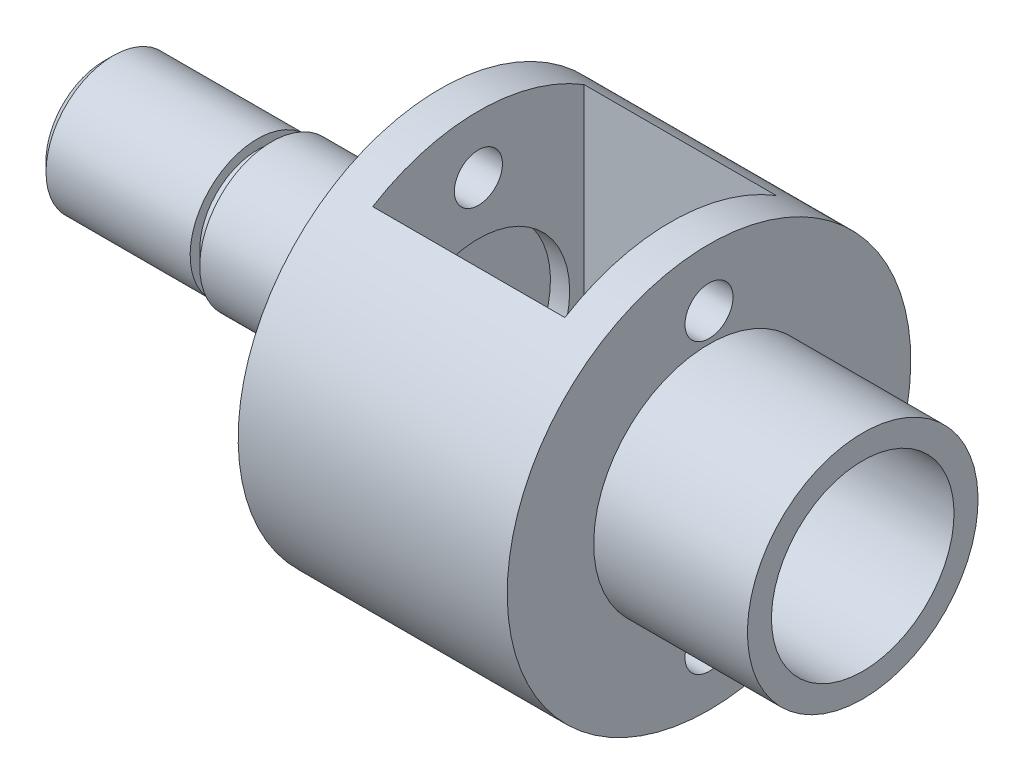
ISO-10303-21;
HEADER;
FILE_DESCRIPTION(('STEP AP214'),'2;1');
FILE_NAME('part.step','',(''),(''),'','','');
FILE_SCHEMA(('AUTOMOTIVE_DESIGN { 1 0 10303 214 1 1 1 1 }'));
ENDSEC;
DATA;
#1=APPLICATION_CONTEXT('core data for automotive mechanical design processes');
#2=APPLICATION_PROTOCOL_DEFINITION('international standard','automotive_design',2000,#1);
#3=PRODUCT_CONTEXT('',#1,'mechanical');
#4=PRODUCT('Part','Part','',(#3));
#5=PRODUCT_RELATED_PRODUCT_CATEGORY('part','',(#4));
#6=PRODUCT_DEFINITION_FORMATION('','',#4);
#7=PRODUCT_DEFINITION_CONTEXT('part definition',#1,'design');
#8=PRODUCT_DEFINITION('design','',#6,#7);
#9=PRODUCT_DEFINITION_SHAPE('','',#8);
#10=(LENGTH_UNIT() NAMED_UNIT(*) SI_UNIT(.MILLI.,.METRE.));
#11=(NAMED_UNIT(*) PLANE_ANGLE_UNIT() SI_UNIT($,.RADIAN.));
#12=(NAMED_UNIT(*) SI_UNIT($,.STERADIAN.) SOLID_ANGLE_UNIT());
#13=UNCERTAINTY_MEASURE_WITH_UNIT(LENGTH_MEASURE(1.E-05),#10,'distance_accuracy_value','');
#14=(GEOMETRIC_REPRESENTATION_CONTEXT(3) GLOBAL_UNCERTAINTY_ASSIGNED_CONTEXT((#13)) GLOBAL_UNIT_ASSIGNED_CONTEXT((#10,
#11,#12)) REPRESENTATION_CONTEXT('',''));
#15=CARTESIAN_POINT('',(0.,0.,0.));
#16=DIRECTION('',(0.,0.,1.));
#17=DIRECTION('',(1.,0.,0.));
#18=AXIS2_PLACEMENT_3D('',#15,#16,#17);
#19=CARTESIAN_POINT('',(-21.,0.,0.));
#20=DIRECTION('',(-1.,0.,0.));
#21=DIRECTION('',(0.,-1.,0.));
#22=AXIS2_PLACEMENT_3D('',#19,#20,#21);
#23=CYLINDRICAL_SURFACE('',#22,4.75);
#24=CARTESIAN_POINT('',(0.,0.,0.));
#25=DIRECTION('',(-1.,0.,0.));
#26=DIRECTION('',(0.,-1.,0.));
#27=AXIS2_PLACEMENT_3D('',#24,#25,#26);
#28=CIRCLE('',#27,4.75);
#29=CARTESIAN_POINT('',(0.,-4.75,0.));
#30=VERTEX_POINT('',#29);
#31=EDGE_CURVE('E194',#30,#30,#28,.T.);
#32=ORIENTED_EDGE('',*,*,#31,.F.);
#33=EDGE_LOOP('',(#32));
#34=FACE_BOUND('',#33,.T.);
#35=CARTESIAN_POINT('',(-10.,0.,0.));
#36=DIRECTION('',(-1.,0.,0.));
#37=DIRECTION('',(0.,0.,1.));
#38=AXIS2_PLACEMENT_3D('',#35,#36,#37);
#39=CIRCLE('',#38,4.75);
#40=CARTESIAN_POINT('',(-10.,0.,4.75));
#41=VERTEX_POINT('',#40);
#42=EDGE_CURVE('E122',#41,#41,#39,.T.);
#43=ORIENTED_EDGE('',*,*,#42,.T.);
#44=EDGE_LOOP('',(#43));
#45=FACE_BOUND('',#44,.T.);
#46=ADVANCED_FACE('F49',(#34,#45),#23,.F.);
#47=CARTESIAN_POINT('',(-21.,0.,0.));
#48=DIRECTION('',(-1.,0.,0.));
#49=DIRECTION('',(0.,-1.,0.));
#50=AXIS2_PLACEMENT_3D('',#47,#48,#49);
#51=CYLINDRICAL_SURFACE('',#50,10.5);
#52=CARTESIAN_POINT('',(-20.,0.,0.));
#53=DIRECTION('',(-1.,0.,0.));
#54=DIRECTION('',(0.,0.,1.));
#55=AXIS2_PLACEMENT_3D('',#52,#53,#54);
#56=CIRCLE('',#55,10.5);
#57=CARTESIAN_POINT('',(-20.,-8.94427190999916,5.5));
#58=VERTEX_POINT('',#57);
#59=CARTESIAN_POINT('',(-20.,-8.94427190999916,-5.5));
#60=VERTEX_POINT('',#59);
#61=EDGE_CURVE('E101',#58,#60,#56,.F.);
#62=ORIENTED_EDGE('',*,*,#61,.F.);
#63=DIRECTION('',(-1.,0.,0.));
#64=VECTOR('',#63,1.);
#65=CARTESIAN_POINT('',(-21.,-8.94427190999916,5.5));
#66=LINE('',#65,#64);
#67=CARTESIAN_POINT('',(-10.,-8.94427190999916,5.5));
#68=VERTEX_POINT('',#67);
#69=EDGE_CURVE('E118',#68,#58,#66,.T.);
#70=ORIENTED_EDGE('',*,*,#69,.F.);
#71=CARTESIAN_POINT('',(-10.,0.,0.));
#72=DIRECTION('',(1.,0.,0.));
#73=DIRECTION('',(0.,0.,-1.));
#74=AXIS2_PLACEMENT_3D('',#71,#72,#73);
#75=CIRCLE('',#74,10.5);
#76=CARTESIAN_POINT('',(-10.,-8.94427190999916,-5.5));
#77=VERTEX_POINT('',#76);
#78=EDGE_CURVE('E114',#77,#68,#75,.F.);
#79=ORIENTED_EDGE('',*,*,#78,.F.);
#80=DIRECTION('',(-1.,0.,0.));
#81=VECTOR('',#80,1.);
#82=CARTESIAN_POINT('',(-21.,-8.94427190999916,-5.5));
#83=LINE('',#82,#81);
#84=EDGE_CURVE('E73',#60,#77,#83,.F.);
#85=ORIENTED_EDGE('',*,*,#84,.F.);
#86=EDGE_LOOP('',(#62,#70,#79,#85));
#87=FACE_BOUND('',#86,.T.);
#88=CARTESIAN_POINT('',(-22.,0.,0.));
#89=DIRECTION('',(-1.,0.,0.));
#90=DIRECTION('',(0.,-1.,0.));
#91=AXIS2_PLACEMENT_3D('',#88,#89,#90);
#92=CIRCLE('',#91,10.5);
#93=CARTESIAN_POINT('',(-22.,-10.5,0.));
#94=VERTEX_POINT('',#93);
#95=EDGE_CURVE('E182',#94,#94,#92,.T.);
#96=ORIENTED_EDGE('',*,*,#95,.F.);
#97=EDGE_LOOP('',(#96));
#98=FACE_BOUND('',#97,.T.);
#99=CARTESIAN_POINT('',(-8.,0.,0.));
#100=DIRECTION('',(-1.,0.,0.));
#101=DIRECTION('',(0.,-1.,0.));
#102=AXIS2_PLACEMENT_3D('',#99,#100,#101);
#103=CIRCLE('',#102,10.5);
#104=CARTESIAN_POINT('',(-8.,-10.5,0.));
#105=VERTEX_POINT('',#104);
#106=EDGE_CURVE('E185',#105,#105,#103,.T.);
#107=ORIENTED_EDGE('',*,*,#106,.T.);
#108=EDGE_LOOP('',(#107));
#109=FACE_BOUND('',#108,.T.);
#110=CARTESIAN_POINT('',(-20.,0.,0.));
#111=DIRECTION('',(1.,0.,0.));
#112=DIRECTION('',(0.,0.,-1.));
#113=AXIS2_PLACEMENT_3D('',#110,#111,#112);
#114=CIRCLE('',#113,10.5);
#115=CARTESIAN_POINT('',(-20.,8.94427190999916,5.5));
#116=VERTEX_POINT('',#115);
#117=CARTESIAN_POINT('',(-20.,8.94427190999916,-5.5));
#118=VERTEX_POINT('',#117);
#119=EDGE_CURVE('E135',#116,#118,#114,.F.);
#120=ORIENTED_EDGE('',*,*,#119,.T.);
#121=DIRECTION('',(-1.,0.,0.));
#122=VECTOR('',#121,1.);
#123=CARTESIAN_POINT('',(-21.,8.94427190999916,-5.5));
#124=LINE('',#123,#122);
#125=CARTESIAN_POINT('',(-10.,8.94427190999916,-5.5));
#126=VERTEX_POINT('',#125);
#127=EDGE_CURVE('E94',#118,#126,#124,.F.);
#128=ORIENTED_EDGE('',*,*,#127,.T.);
#129=CARTESIAN_POINT('',(-10.,0.,0.));
#130=DIRECTION('',(-1.,0.,0.));
#131=DIRECTION('',(0.,0.,1.));
#132=AXIS2_PLACEMENT_3D('',#129,#130,#131);
#133=CIRCLE('',#132,10.5);
#134=CARTESIAN_POINT('',(-10.,8.94427190999916,5.5));
#135=VERTEX_POINT('',#134);
#136=EDGE_CURVE('E97',#126,#135,#133,.F.);
#137=ORIENTED_EDGE('',*,*,#136,.T.);
#138=DIRECTION('',(-1.,0.,0.));
#139=VECTOR('',#138,1.);
#140=CARTESIAN_POINT('',(-21.,8.94427190999916,5.5));
#141=LINE('',#140,#139);
#142=EDGE_CURVE('E132',#135,#116,#141,.T.);
#143=ORIENTED_EDGE('',*,*,#142,.T.);
#144=EDGE_LOOP('',(#120,#128,#137,#143));
#145=FACE_BOUND('',#144,.T.);
#146=ADVANCED_FACE('F112',(#87,#98,#109,#145),#51,.T.);
#147=CARTESIAN_POINT('',(-8.,-7.5,0.));
#148=DIRECTION('',(1.,0.,0.));
#149=DIRECTION('',(0.,0.,-1.));
#150=AXIS2_PLACEMENT_3D('',#147,#148,#149);
#151=CYLINDRICAL_SURFACE('',#150,1.24999999999999);
#152=CARTESIAN_POINT('',(-22.,-7.5,0.));
#153=DIRECTION('',(1.,0.,0.));
#154=DIRECTION('',(0.,1.,0.));
#155=AXIS2_PLACEMENT_3D('',#152,#153,#154);
#156=CIRCLE('',#155,1.24999999999999);
#157=CARTESIAN_POINT('',(-22.,-6.25000000000001,0.));
#158=VERTEX_POINT('',#157);
#159=EDGE_CURVE('E155',#158,#158,#156,.T.);
#160=ORIENTED_EDGE('',*,*,#159,.F.);
#161=EDGE_LOOP('',(#160));
#162=FACE_BOUND('',#161,.T.);
#163=CARTESIAN_POINT('',(-20.,-7.5,0.));
#164=DIRECTION('',(-1.,0.,0.));
#165=DIRECTION('',(0.,0.,1.));
#166=AXIS2_PLACEMENT_3D('',#163,#164,#165);
#167=CIRCLE('',#166,1.24999999999999);
#168=CARTESIAN_POINT('',(-20.,-7.5,1.25000000000004));
#169=VERTEX_POINT('',#168);
#170=EDGE_CURVE('E109',#169,#169,#167,.T.);
#171=ORIENTED_EDGE('',*,*,#170,.F.);
#172=EDGE_LOOP('',(#171));
#173=FACE_BOUND('',#172,.T.);
#174=ADVANCED_FACE('F217',(#162,#173),#151,.F.);
#175=CARTESIAN_POINT('',(-8.,-7.5,0.));
#176=DIRECTION('',(1.,0.,0.));
#177=DIRECTION('',(0.,0.,-1.));
#178=AXIS2_PLACEMENT_3D('',#175,#176,#177);
#179=CIRCLE('',#178,1.24999999999999);
#180=CARTESIAN_POINT('',(-8.,-7.5,-1.24999999999993));
#181=VERTEX_POINT('',#180);
#182=EDGE_CURVE('E152',#181,#181,#179,.T.);
#183=ORIENTED_EDGE('',*,*,#182,.T.);
#184=EDGE_LOOP('',(#183));
#185=FACE_BOUND('',#184,.T.);
#186=CARTESIAN_POINT('',(-10.,-7.5,0.));
#187=DIRECTION('',(1.,0.,0.));
#188=DIRECTION('',(0.,0.,-1.));
#189=AXIS2_PLACEMENT_3D('',#186,#187,#188);
#190=CIRCLE('',#189,1.24999999999999);
#191=CARTESIAN_POINT('',(-10.,-7.5,-1.24999999999994));
#192=VERTEX_POINT('',#191);
#193=EDGE_CURVE('E108',#192,#192,#190,.T.);
#194=ORIENTED_EDGE('',*,*,#193,.F.);
#195=EDGE_LOOP('',(#194));
#196=FACE_BOUND('',#195,.T.);
#197=ADVANCED_FACE('F273',(#185,#196),#151,.F.);
#198=CARTESIAN_POINT('',(-8.,7.5,0.));
#199=DIRECTION('',(1.,0.,0.));
#200=DIRECTION('',(0.,0.,-1.));
#201=AXIS2_PLACEMENT_3D('',#198,#199,#200);
#202=CYLINDRICAL_SURFACE('',#201,1.24999999999999);
#203=CARTESIAN_POINT('',(-22.,7.5,0.));
#204=DIRECTION('',(1.,0.,0.));
#205=DIRECTION('',(0.,1.,0.));
#206=AXIS2_PLACEMENT_3D('',#203,#204,#205);
#207=CIRCLE('',#206,1.24999999999999);
#208=CARTESIAN_POINT('',(-22.,8.74999999999999,0.));
#209=VERTEX_POINT('',#208);
#210=EDGE_CURVE('E149',#209,#209,#207,.T.);
#211=ORIENTED_EDGE('',*,*,#210,.F.);
#212=EDGE_LOOP('',(#211));
#213=FACE_BOUND('',#212,.T.);
#214=CARTESIAN_POINT('',(-20.,7.5,0.));
#215=DIRECTION('',(1.,0.,0.));
#216=DIRECTION('',(0.,0.,-1.));
#217=AXIS2_PLACEMENT_3D('',#214,#215,#216);
#218=CIRCLE('',#217,1.24999999999999);
#219=CARTESIAN_POINT('',(-20.,7.5,-1.24999999999999));
#220=VERTEX_POINT('',#219);
#221=EDGE_CURVE('E129',#220,#220,#218,.T.);
#222=ORIENTED_EDGE('',*,*,#221,.T.);
#223=EDGE_LOOP('',(#222));
#224=FACE_BOUND('',#223,.T.);
#225=ADVANCED_FACE('F275',(#213,#224),#202,.F.);
#226=CARTESIAN_POINT('',(-8.,7.5,0.));
#227=DIRECTION('',(1.,0.,0.));
#228=DIRECTION('',(0.,0.,-1.));
#229=AXIS2_PLACEMENT_3D('',#226,#227,#228);
#230=CIRCLE('',#229,1.24999999999999);
#231=CARTESIAN_POINT('',(-8.,7.5,-1.24999999999999));
#232=VERTEX_POINT('',#231);
#233=EDGE_CURVE('E146',#232,#232,#230,.T.);
#234=ORIENTED_EDGE('',*,*,#233,.T.);
#235=EDGE_LOOP('',(#234));
#236=FACE_BOUND('',#235,.T.);
#237=CARTESIAN_POINT('',(-10.,7.5,0.));
#238=DIRECTION('',(-1.,0.,0.));
#239=DIRECTION('',(0.,0.,1.));
#240=AXIS2_PLACEMENT_3D('',#237,#238,#239);
#241=CIRCLE('',#240,1.24999999999999);
#242=CARTESIAN_POINT('',(-10.,7.5,1.24999999999999));
#243=VERTEX_POINT('',#242);
#244=EDGE_CURVE('E128',#243,#243,#241,.T.);
#245=ORIENTED_EDGE('',*,*,#244,.T.);
#246=EDGE_LOOP('',(#245));
#247=FACE_BOUND('',#246,.T.);
#248=ADVANCED_FACE('F233',(#236,#247),#202,.F.);
#249=CARTESIAN_POINT('',(-8.,6.,0.));
#250=DIRECTION('',(-1.,0.,0.));
#251=DIRECTION('',(0.,-1.,0.));
#252=AXIS2_PLACEMENT_3D('',#249,#250,#251);
#253=PLANE('',#252);
#254=ORIENTED_EDGE('',*,*,#182,.F.);
#255=EDGE_LOOP('',(#254));
#256=FACE_BOUND('',#255,.T.);
#257=ORIENTED_EDGE('',*,*,#106,.F.);
#258=EDGE_LOOP('',(#257));
#259=FACE_BOUND('',#258,.T.);
#260=CARTESIAN_POINT('',(-8.,0.,0.));
#261=DIRECTION('',(-1.,0.,0.));
#262=DIRECTION('',(0.,-1.,0.));
#263=AXIS2_PLACEMENT_3D('',#260,#261,#262);
#264=CIRCLE('',#263,6.);
#265=CARTESIAN_POINT('',(-8.,-6.,0.));
#266=VERTEX_POINT('',#265);
#267=EDGE_CURVE('E188',#266,#266,#264,.T.);
#268=ORIENTED_EDGE('',*,*,#267,.T.);
#269=EDGE_LOOP('',(#268));
#270=FACE_BOUND('',#269,.T.);
#271=ORIENTED_EDGE('',*,*,#233,.F.);
#272=EDGE_LOOP('',(#271));
#273=FACE_BOUND('',#272,.T.);
#274=ADVANCED_FACE('F226',(#256,#259,#270,#273),#253,.F.);
#275=CARTESIAN_POINT('',(0.,4.75,0.));
#276=DIRECTION('',(-1.,0.,0.));
#277=DIRECTION('',(0.,-1.,0.));
#278=AXIS2_PLACEMENT_3D('',#275,#276,#277);
#279=PLANE('',#278);
#280=CARTESIAN_POINT('',(0.,0.,0.));
#281=DIRECTION('',(-1.,0.,0.));
#282=DIRECTION('',(0.,-1.,0.));
#283=AXIS2_PLACEMENT_3D('',#280,#281,#282);
#284=CIRCLE('',#283,6.);
#285=CARTESIAN_POINT('',(0.,-6.,0.));
#286=VERTEX_POINT('',#285);
#287=EDGE_CURVE('E191',#286,#286,#284,.T.);
#288=ORIENTED_EDGE('',*,*,#287,.F.);
#289=EDGE_LOOP('',(#288));
#290=FACE_BOUND('',#289,.T.);
#291=ORIENTED_EDGE('',*,*,#31,.T.);
#292=EDGE_LOOP('',(#291));
#293=FACE_BOUND('',#292,.T.);
#294=ADVANCED_FACE('F222',(#290,#293),#279,.F.);
#295=CARTESIAN_POINT('',(-21.,0.,0.));
#296=DIRECTION('',(-1.,0.,0.));
#297=DIRECTION('',(0.,-1.,0.));
#298=AXIS2_PLACEMENT_3D('',#295,#296,#297);
#299=CYLINDRICAL_SURFACE('',#298,6.);
#300=ORIENTED_EDGE('',*,*,#267,.F.);
#301=EDGE_LOOP('',(#300));
#302=FACE_BOUND('',#301,.T.);
#303=ORIENTED_EDGE('',*,*,#287,.T.);
#304=EDGE_LOOP('',(#303));
#305=FACE_BOUND('',#304,.T.);
#306=ADVANCED_FACE('F225',(#302,#305),#299,.T.);
#307=CARTESIAN_POINT('',(-22.,10.5,0.));
#308=DIRECTION('',(1.,0.,0.));
#309=DIRECTION('',(0.,1.,0.));
#310=AXIS2_PLACEMENT_3D('',#307,#308,#309);
#311=PLANE('',#310);
#312=ORIENTED_EDGE('',*,*,#210,.T.);
#313=EDGE_LOOP('',(#312));
#314=FACE_BOUND('',#313,.T.);
#315=ORIENTED_EDGE('',*,*,#159,.T.);
#316=EDGE_LOOP('',(#315));
#317=FACE_BOUND('',#316,.T.);
#318=CARTESIAN_POINT('',(-22.,0.,0.));
#319=DIRECTION('',(-1.,0.,0.));
#320=DIRECTION('',(0.,-1.,0.));
#321=AXIS2_PLACEMENT_3D('',#318,#319,#320);
#322=CIRCLE('',#321,6.);
#323=CARTESIAN_POINT('',(-22.,-6.00000000000001,0.));
#324=VERTEX_POINT('',#323);
#325=EDGE_CURVE('E179',#324,#324,#322,.T.);
#326=ORIENTED_EDGE('',*,*,#325,.F.);
#327=EDGE_LOOP('',(#326));
#328=FACE_BOUND('',#327,.T.);
#329=ORIENTED_EDGE('',*,*,#95,.T.);
#330=EDGE_LOOP('',(#329));
#331=FACE_BOUND('',#330,.T.);
#332=ADVANCED_FACE('F230',(#314,#317,#328,#331),#311,.F.);
#333=CARTESIAN_POINT('',(-21.,0.,0.));
#334=DIRECTION('',(-1.,0.,0.));
#335=DIRECTION('',(0.,-1.,0.));
#336=AXIS2_PLACEMENT_3D('',#333,#334,#335);
#337=CYLINDRICAL_SURFACE('',#336,6.);
#338=CARTESIAN_POINT('',(-24.5,0.,0.));
#339=DIRECTION('',(-1.,0.,0.));
#340=DIRECTION('',(0.,-1.,0.));
#341=AXIS2_PLACEMENT_3D('',#338,#339,#340);
#342=CIRCLE('',#341,6.);
#343=CARTESIAN_POINT('',(-24.5,-6.00000000000001,0.));
#344=VERTEX_POINT('',#343);
#345=EDGE_CURVE('E176',#344,#344,#342,.T.);
#346=ORIENTED_EDGE('',*,*,#345,.F.);
#347=EDGE_LOOP('',(#346));
#348=FACE_BOUND('',#347,.T.);
#349=ORIENTED_EDGE('',*,*,#325,.T.);
#350=EDGE_LOOP('',(#349));
#351=FACE_BOUND('',#350,.T.);
#352=ADVANCED_FACE('F237',(#348,#351),#337,.T.);
#353=CARTESIAN_POINT('',(-24.5,6.,0.));
#354=DIRECTION('',(1.,0.,0.));
#355=DIRECTION('',(0.,1.,0.));
#356=AXIS2_PLACEMENT_3D('',#353,#354,#355);
#357=PLANE('',#356);
#358=CARTESIAN_POINT('',(-24.5,0.,0.));
#359=DIRECTION('',(-1.,0.,0.));
#360=DIRECTION('',(0.,-1.,0.));
#361=AXIS2_PLACEMENT_3D('',#358,#359,#360);
#362=CIRCLE('',#361,3.75);
#363=CARTESIAN_POINT('',(-24.5,-3.75000000000001,0.));
#364=VERTEX_POINT('',#363);
#365=EDGE_CURVE('E173',#364,#364,#362,.T.);
#366=ORIENTED_EDGE('',*,*,#365,.F.);
#367=EDGE_LOOP('',(#366));
#368=FACE_BOUND('',#367,.T.);
#369=ORIENTED_EDGE('',*,*,#345,.T.);
#370=EDGE_LOOP('',(#369));
#371=FACE_BOUND('',#370,.T.);
#372=ADVANCED_FACE('F241',(#368,#371),#357,.F.);
#373=CARTESIAN_POINT('',(-21.,0.,0.));
#374=DIRECTION('',(-1.,0.,0.));
#375=DIRECTION('',(0.,-1.,0.));
#376=AXIS2_PLACEMENT_3D('',#373,#374,#375);
#377=CYLINDRICAL_SURFACE('',#376,3.75);
#378=CARTESIAN_POINT('',(-30.75,0.,0.));
#379=DIRECTION('',(-1.,0.,0.));
#380=DIRECTION('',(0.,-1.,0.));
#381=AXIS2_PLACEMENT_3D('',#378,#379,#380);
#382=CIRCLE('',#381,3.75);
#383=CARTESIAN_POINT('',(-30.75,-3.75000000000001,0.));
#384=VERTEX_POINT('',#383);
#385=EDGE_CURVE('E170',#384,#384,#382,.T.);
#386=ORIENTED_EDGE('',*,*,#385,.F.);
#387=EDGE_LOOP('',(#386));
#388=FACE_BOUND('',#387,.T.);
#389=ORIENTED_EDGE('',*,*,#365,.T.);
#390=EDGE_LOOP('',(#389));
#391=FACE_BOUND('',#390,.T.);
#392=ADVANCED_FACE('F245',(#388,#391),#377,.T.);
#393=CARTESIAN_POINT('',(-30.75,3.75,0.));
#394=DIRECTION('',(1.,0.,0.));
#395=DIRECTION('',(0.,1.,0.));
#396=AXIS2_PLACEMENT_3D('',#393,#394,#395);
#397=PLANE('',#396);
#398=CARTESIAN_POINT('',(-30.75,0.,0.));
#399=DIRECTION('',(-1.,0.,0.));
#400=DIRECTION('',(0.,-1.,0.));
#401=AXIS2_PLACEMENT_3D('',#398,#399,#400);
#402=CIRCLE('',#401,3.);
#403=CARTESIAN_POINT('',(-30.75,-3.00000000000001,0.));
#404=VERTEX_POINT('',#403);
#405=EDGE_CURVE('E167',#404,#404,#402,.T.);
#406=ORIENTED_EDGE('',*,*,#405,.F.);
#407=EDGE_LOOP('',(#406));
#408=FACE_BOUND('',#407,.T.);
#409=ORIENTED_EDGE('',*,*,#385,.T.);
#410=EDGE_LOOP('',(#409));
#411=FACE_BOUND('',#410,.T.);
#412=ADVANCED_FACE('F249',(#408,#411),#397,.F.);
#413=CARTESIAN_POINT('',(-21.,0.,0.));
#414=DIRECTION('',(-1.,0.,0.));
#415=DIRECTION('',(0.,-1.,0.));
#416=AXIS2_PLACEMENT_3D('',#413,#414,#415);
#417=CYLINDRICAL_SURFACE('',#416,3.);
#418=CARTESIAN_POINT('',(-31.5,0.,0.));
#419=DIRECTION('',(-1.,0.,0.));
#420=DIRECTION('',(0.,-1.,0.));
#421=AXIS2_PLACEMENT_3D('',#418,#419,#420);
#422=CIRCLE('',#421,3.);
#423=CARTESIAN_POINT('',(-31.5,-3.00000000000001,0.));
#424=VERTEX_POINT('',#423);
#425=EDGE_CURVE('E164',#424,#424,#422,.T.);
#426=ORIENTED_EDGE('',*,*,#425,.F.);
#427=EDGE_LOOP('',(#426));
#428=FACE_BOUND('',#427,.T.);
#429=ORIENTED_EDGE('',*,*,#405,.T.);
#430=EDGE_LOOP('',(#429));
#431=FACE_BOUND('',#430,.T.);
#432=ADVANCED_FACE('F253',(#428,#431),#417,.T.);
#433=CARTESIAN_POINT('',(-31.5,3.,0.));
#434=DIRECTION('',(-1.,0.,0.));
#435=DIRECTION('',(0.,-1.,0.));
#436=AXIS2_PLACEMENT_3D('',#433,#434,#435);
#437=PLANE('',#436);
#438=CARTESIAN_POINT('',(-31.5,0.,0.));
#439=DIRECTION('',(-1.,0.,0.));
#440=DIRECTION('',(0.,-1.,0.));
#441=AXIS2_PLACEMENT_3D('',#438,#439,#440);
#442=CIRCLE('',#441,3.5);
#443=CARTESIAN_POINT('',(-31.5,-3.50000000000001,0.));
#444=VERTEX_POINT('',#443);
#445=EDGE_CURVE('E161',#444,#444,#442,.T.);
#446=ORIENTED_EDGE('',*,*,#445,.F.);
#447=EDGE_LOOP('',(#446));
#448=FACE_BOUND('',#447,.T.);
#449=ORIENTED_EDGE('',*,*,#425,.T.);
#450=EDGE_LOOP('',(#449));
#451=FACE_BOUND('',#450,.T.);
#452=ADVANCED_FACE('F257',(#448,#451),#437,.F.);
#453=CARTESIAN_POINT('',(-21.,0.,0.));
#454=DIRECTION('',(-1.,0.,0.));
#455=DIRECTION('',(0.,-1.,0.));
#456=AXIS2_PLACEMENT_3D('',#453,#454,#455);
#457=CYLINDRICAL_SURFACE('',#456,3.5);
#458=CARTESIAN_POINT('',(-39.,0.,0.));
#459=DIRECTION('',(1.,0.,0.));
#460=DIRECTION('',(0.,1.,0.));
#461=AXIS2_PLACEMENT_3D('',#458,#459,#460);
#462=CIRCLE('',#461,3.5);
#463=CARTESIAN_POINT('',(-39.,3.5,0.));
#464=VERTEX_POINT('',#463);
#465=EDGE_CURVE('E11',#464,#464,#462,.T.);
#466=ORIENTED_EDGE('',*,*,#465,.T.);
#467=EDGE_LOOP('',(#466));
#468=FACE_BOUND('',#467,.T.);
#469=ORIENTED_EDGE('',*,*,#445,.T.);
#470=EDGE_LOOP('',(#469));
#471=FACE_BOUND('',#470,.T.);
#472=ADVANCED_FACE('F261',(#468,#471),#457,.T.);
#473=CARTESIAN_POINT('',(-39.5,3.5,0.));
#474=DIRECTION('',(1.,0.,0.));
#475=DIRECTION('',(0.,1.,0.));
#476=AXIS2_PLACEMENT_3D('',#473,#474,#475);
#477=PLANE('',#476);
#478=CARTESIAN_POINT('',(-39.5,0.,0.));
#479=DIRECTION('',(1.,0.,0.));
#480=DIRECTION('',(0.,1.,0.));
#481=AXIS2_PLACEMENT_3D('',#478,#479,#480);
#482=CIRCLE('',#481,3.00000000000001);
#483=CARTESIAN_POINT('',(-39.5,3.,0.));
#484=VERTEX_POINT('',#483);
#485=EDGE_CURVE('E58',#484,#484,#482,.F.);
#486=ORIENTED_EDGE('',*,*,#485,.T.);
#487=EDGE_LOOP('',(#486));
#488=FACE_BOUND('',#487,.T.);
#489=ADVANCED_FACE('F199',(#488),#477,.F.);
#490=CARTESIAN_POINT('',(-20.,10.501,-5.5));
#491=DIRECTION('',(0.,0.,1.));
#492=DIRECTION('',(1.,0.,0.));
#493=AXIS2_PLACEMENT_3D('',#490,#491,#492);
#494=PLANE('',#493);
#495=DIRECTION('',(0.,-1.,0.));
#496=VECTOR('',#495,1.);
#497=CARTESIAN_POINT('',(-20.,10.501,-5.5));
#498=LINE('',#497,#496);
#499=EDGE_CURVE('E90',#118,#60,#498,.T.);
#500=ORIENTED_EDGE('',*,*,#499,.T.);
#501=ORIENTED_EDGE('',*,*,#84,.T.);
#502=DIRECTION('',(0.,-1.,0.));
#503=VECTOR('',#502,1.);
#504=CARTESIAN_POINT('',(-10.,10.501,-5.5));
#505=LINE('',#504,#503);
#506=EDGE_CURVE('E138',#126,#77,#505,.T.);
#507=ORIENTED_EDGE('',*,*,#506,.F.);
#508=ORIENTED_EDGE('',*,*,#127,.F.);
#509=EDGE_LOOP('',(#500,#501,#507,#508));
#510=FACE_BOUND('',#509,.T.);
#511=ADVANCED_FACE('F92',(#510),#494,.T.);
#512=CARTESIAN_POINT('',(-20.,10.501,5.5));
#513=DIRECTION('',(0.,0.,-1.));
#514=DIRECTION('',(-1.,0.,0.));
#515=AXIS2_PLACEMENT_3D('',#512,#513,#514);
#516=PLANE('',#515);
#517=DIRECTION('',(0.,-1.,0.));
#518=VECTOR('',#517,1.);
#519=CARTESIAN_POINT('',(-10.,10.501,5.5));
#520=LINE('',#519,#518);
#521=EDGE_CURVE('E65',#135,#68,#520,.T.);
#522=ORIENTED_EDGE('',*,*,#521,.T.);
#523=ORIENTED_EDGE('',*,*,#69,.T.);
#524=DIRECTION('',(0.,-1.,0.));
#525=VECTOR('',#524,1.);
#526=CARTESIAN_POINT('',(-20.,10.501,5.5));
#527=LINE('',#526,#525);
#528=EDGE_CURVE('E98',#116,#58,#527,.T.);
#529=ORIENTED_EDGE('',*,*,#528,.F.);
#530=ORIENTED_EDGE('',*,*,#142,.F.);
#531=EDGE_LOOP('',(#522,#523,#529,#530));
#532=FACE_BOUND('',#531,.T.);
#533=ADVANCED_FACE('F281',(#532),#516,.T.);
#534=CARTESIAN_POINT('',(-20.,10.501,-5.5));
#535=DIRECTION('',(1.,0.,0.));
#536=DIRECTION('',(0.,0.,-1.));
#537=AXIS2_PLACEMENT_3D('',#534,#535,#536);
#538=PLANE('',#537);
#539=ORIENTED_EDGE('',*,*,#61,.T.);
#540=ORIENTED_EDGE('',*,*,#499,.F.);
#541=ORIENTED_EDGE('',*,*,#119,.F.);
#542=ORIENTED_EDGE('',*,*,#528,.T.);
#543=EDGE_LOOP('',(#539,#540,#541,#542));
#544=FACE_BOUND('',#543,.T.);
#545=ORIENTED_EDGE('',*,*,#221,.F.);
#546=EDGE_LOOP('',(#545));
#547=FACE_BOUND('',#546,.T.);
#548=CARTESIAN_POINT('',(-20.,0.,0.));
#549=DIRECTION('',(1.,0.,0.));
#550=DIRECTION('',(0.,0.,-1.));
#551=AXIS2_PLACEMENT_3D('',#548,#549,#550);
#552=CIRCLE('',#551,4.75);
#553=CARTESIAN_POINT('',(-20.,0.,-4.75));
#554=VERTEX_POINT('',#553);
#555=EDGE_CURVE('E125',#554,#554,#552,.T.);
#556=ORIENTED_EDGE('',*,*,#555,.F.);
#557=EDGE_LOOP('',(#556));
#558=FACE_BOUND('',#557,.T.);
#559=ORIENTED_EDGE('',*,*,#170,.T.);
#560=EDGE_LOOP('',(#559));
#561=FACE_BOUND('',#560,.T.);
#562=ADVANCED_FACE('F102',(#544,#547,#558,#561),#538,.T.);
#563=CARTESIAN_POINT('',(-10.,10.501,-5.5));
#564=DIRECTION('',(-1.,0.,0.));
#565=DIRECTION('',(0.,0.,1.));
#566=AXIS2_PLACEMENT_3D('',#563,#564,#565);
#567=PLANE('',#566);
#568=ORIENTED_EDGE('',*,*,#42,.F.);
#569=EDGE_LOOP('',(#568));
#570=FACE_BOUND('',#569,.T.);
#571=ORIENTED_EDGE('',*,*,#244,.F.);
#572=EDGE_LOOP('',(#571));
#573=FACE_BOUND('',#572,.T.);
#574=ORIENTED_EDGE('',*,*,#521,.F.);
#575=ORIENTED_EDGE('',*,*,#136,.F.);
#576=ORIENTED_EDGE('',*,*,#506,.T.);
#577=ORIENTED_EDGE('',*,*,#78,.T.);
#578=EDGE_LOOP('',(#574,#575,#576,#577));
#579=FACE_BOUND('',#578,.T.);
#580=ORIENTED_EDGE('',*,*,#193,.T.);
#581=EDGE_LOOP('',(#580));
#582=FACE_BOUND('',#581,.T.);
#583=ADVANCED_FACE('F269',(#570,#573,#579,#582),#567,.T.);
#584=CARTESIAN_POINT('',(-21.,4.75,0.));
#585=DIRECTION('',(-1.,0.,0.));
#586=DIRECTION('',(0.,-1.,0.));
#587=AXIS2_PLACEMENT_3D('',#584,#585,#586);
#588=PLANE('',#587);
#589=CARTESIAN_POINT('',(-21.,0.,0.));
#590=DIRECTION('',(-1.,0.,0.));
#591=DIRECTION('',(0.,-1.,0.));
#592=AXIS2_PLACEMENT_3D('',#589,#590,#591);
#593=CIRCLE('',#592,4.75);
#594=CARTESIAN_POINT('',(-21.,-4.75,0.));
#595=VERTEX_POINT('',#594);
#596=EDGE_CURVE('E158',#595,#595,#593,.T.);
#597=ORIENTED_EDGE('',*,*,#596,.F.);
#598=EDGE_LOOP('',(#597));
#599=FACE_BOUND('',#598,.T.);
#600=ADVANCED_FACE('F208',(#599),#588,.F.);
#601=ORIENTED_EDGE('',*,*,#596,.T.);
#602=EDGE_LOOP('',(#601));
#603=FACE_BOUND('',#602,.T.);
#604=ORIENTED_EDGE('',*,*,#555,.T.);
#605=EDGE_LOOP('',(#604));
#606=FACE_BOUND('',#605,.T.);
#607=ADVANCED_FACE('F202',(#603,#606),#23,.F.);
#608=CARTESIAN_POINT('',(-39.5,0.,0.));
#609=DIRECTION('',(1.,0.,0.));
#610=DIRECTION('',(0.,1.,0.));
#611=AXIS2_PLACEMENT_3D('',#608,#609,#610);
#612=CONICAL_SURFACE('',#611,3.00000000000001,0.785398163397443);
#613=ORIENTED_EDGE('',*,*,#465,.F.);
#614=EDGE_LOOP('',(#613));
#615=FACE_BOUND('',#614,.T.);
#616=ORIENTED_EDGE('',*,*,#485,.F.);
#617=EDGE_LOOP('',(#616));
#618=FACE_BOUND('',#617,.T.);
#619=ADVANCED_FACE('F52',(#615,#618),#612,.T.);
#620=CLOSED_SHELL('',(#46,#146,#174,#197,#225,#248,#274,#294,#306,#332,#352,#372,#392,#412,#432,
#452,#472,#489,#511,#533,#562,#583,#600,#607,#619));
#621=MANIFOLD_SOLID_BREP('B2',#620);
#622=ADVANCED_BREP_SHAPE_REPRESENTATION('',(#18,#621),#14);
#623=SHAPE_DEFINITION_REPRESENTATION(#9,#622);
ENDSEC;
END-ISO-10303-21;
